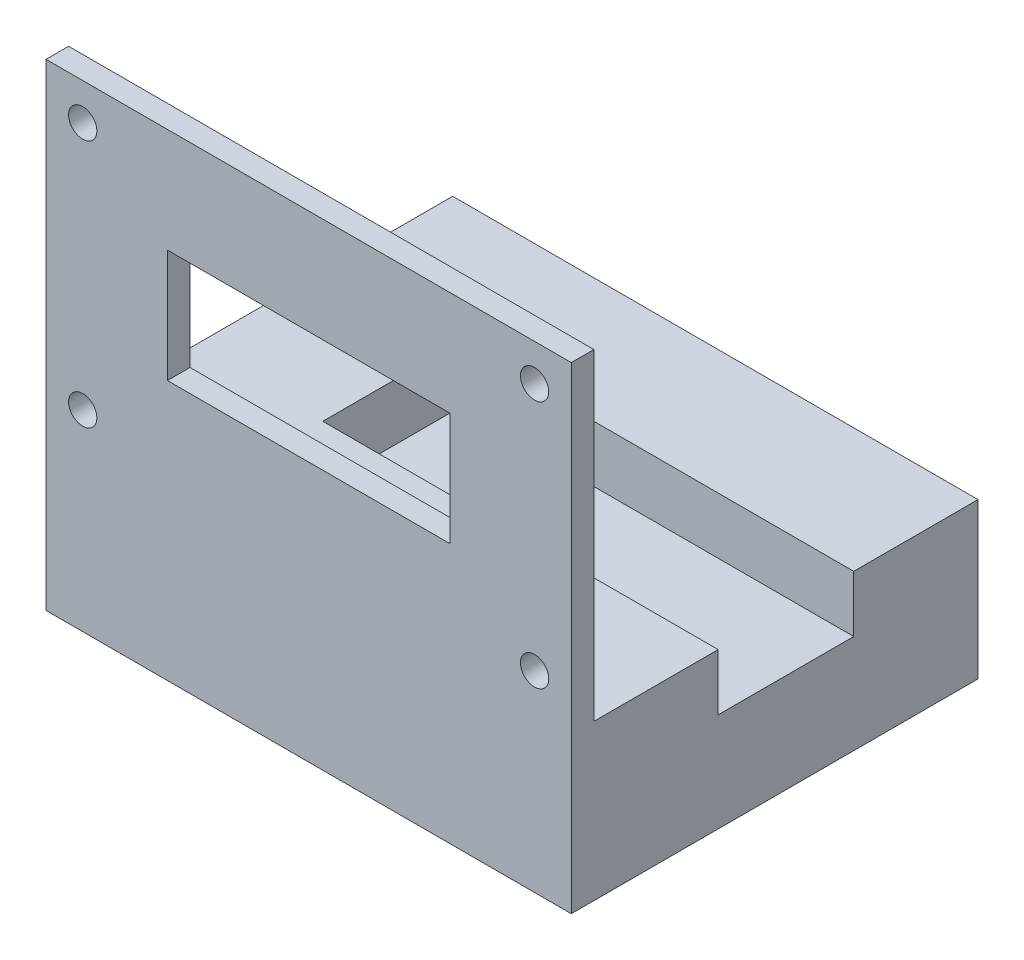
ISO-10303-21;
HEADER;
FILE_DESCRIPTION(('STEP AP214'),'2;1');
FILE_NAME('part.step','',(''),(''),'','','');
FILE_SCHEMA(('AUTOMOTIVE_DESIGN { 1 0 10303 214 1 1 1 1 }'));
ENDSEC;
DATA;
#1=APPLICATION_CONTEXT('core data for automotive mechanical design processes');
#2=APPLICATION_PROTOCOL_DEFINITION('international standard','automotive_design',2000,#1);
#3=PRODUCT_CONTEXT('',#1,'mechanical');
#4=PRODUCT('Part','Part','',(#3));
#5=PRODUCT_RELATED_PRODUCT_CATEGORY('part','',(#4));
#6=PRODUCT_DEFINITION_FORMATION('','',#4);
#7=PRODUCT_DEFINITION_CONTEXT('part definition',#1,'design');
#8=PRODUCT_DEFINITION('design','',#6,#7);
#9=PRODUCT_DEFINITION_SHAPE('','',#8);
#10=(LENGTH_UNIT() NAMED_UNIT(*) SI_UNIT(.MILLI.,.METRE.));
#11=(NAMED_UNIT(*) PLANE_ANGLE_UNIT() SI_UNIT($,.RADIAN.));
#12=(NAMED_UNIT(*) SI_UNIT($,.STERADIAN.) SOLID_ANGLE_UNIT());
#13=UNCERTAINTY_MEASURE_WITH_UNIT(LENGTH_MEASURE(1.E-05),#10,'distance_accuracy_value','');
#14=(GEOMETRIC_REPRESENTATION_CONTEXT(3) GLOBAL_UNCERTAINTY_ASSIGNED_CONTEXT((#13)) GLOBAL_UNIT_ASSIGNED_CONTEXT((#10,
#11,#12)) REPRESENTATION_CONTEXT('',''));
#15=CARTESIAN_POINT('',(0.,0.,0.));
#16=DIRECTION('',(0.,0.,1.));
#17=DIRECTION('',(1.,0.,0.));
#18=AXIS2_PLACEMENT_3D('',#15,#16,#17);
#19=CARTESIAN_POINT('',(23.25,13.75,17.));
#20=DIRECTION('',(-1.,0.,0.));
#21=DIRECTION('',(0.,0.,1.));
#22=AXIS2_PLACEMENT_3D('',#19,#20,#21);
#23=PLANE('',#22);
#24=DIRECTION('',(0.,0.,-1.));
#25=VECTOR('',#24,1.);
#26=CARTESIAN_POINT('',(23.25,8.75,-6.));
#27=LINE('',#26,#25);
#28=CARTESIAN_POINT('',(23.25,8.75,6.));
#29=VERTEX_POINT('',#28);
#30=CARTESIAN_POINT('',(23.25,8.75,-6.));
#31=VERTEX_POINT('',#30);
#32=EDGE_CURVE('E139',#29,#31,#27,.T.);
#33=ORIENTED_EDGE('',*,*,#32,.F.);
#34=DIRECTION('',(0.,1.,0.));
#35=VECTOR('',#34,1.);
#36=CARTESIAN_POINT('',(23.25,8.75,6.));
#37=LINE('',#36,#35);
#38=CARTESIAN_POINT('',(23.25,13.75,6.));
#39=VERTEX_POINT('',#38);
#40=EDGE_CURVE('E183',#29,#39,#37,.T.);
#41=ORIENTED_EDGE('',*,*,#40,.T.);
#42=DIRECTION('',(0.,0.,-1.));
#43=VECTOR('',#42,1.);
#44=CARTESIAN_POINT('',(23.25,13.75,17.));
#45=LINE('',#44,#43);
#46=CARTESIAN_POINT('',(23.25,13.75,17.));
#47=VERTEX_POINT('',#46);
#48=EDGE_CURVE('E238',#47,#39,#45,.T.);
#49=ORIENTED_EDGE('',*,*,#48,.F.);
#50=DIRECTION('',(0.,1.,0.));
#51=VECTOR('',#50,1.);
#52=CARTESIAN_POINT('',(23.25,0.,17.));
#53=LINE('',#52,#51);
#54=CARTESIAN_POINT('',(23.25,42.25,17.));
#55=VERTEX_POINT('',#54);
#56=EDGE_CURVE('E229',#47,#55,#53,.T.);
#57=ORIENTED_EDGE('',*,*,#56,.T.);
#58=DIRECTION('',(0.,0.,-1.));
#59=VECTOR('',#58,1.);
#60=CARTESIAN_POINT('',(23.25,42.25,19.));
#61=LINE('',#60,#59);
#62=CARTESIAN_POINT('',(23.25,42.25,19.));
#63=VERTEX_POINT('',#62);
#64=EDGE_CURVE('E234',#63,#55,#61,.T.);
#65=ORIENTED_EDGE('',*,*,#64,.F.);
#66=DIRECTION('',(0.,1.,0.));
#67=VECTOR('',#66,1.);
#68=CARTESIAN_POINT('',(23.25,0.,19.));
#69=LINE('',#68,#67);
#70=CARTESIAN_POINT('',(23.25,0.,19.));
#71=VERTEX_POINT('',#70);
#72=EDGE_CURVE('E222',#71,#63,#69,.T.);
#73=ORIENTED_EDGE('',*,*,#72,.F.);
#74=DIRECTION('',(0.,0.,-1.));
#75=VECTOR('',#74,1.);
#76=CARTESIAN_POINT('',(23.25,0.,17.));
#77=LINE('',#76,#75);
#78=CARTESIAN_POINT('',(23.25,0.,-17.));
#79=VERTEX_POINT('',#78);
#80=EDGE_CURVE('E237',#71,#79,#77,.T.);
#81=ORIENTED_EDGE('',*,*,#80,.T.);
#82=DIRECTION('',(0.,-1.,0.));
#83=VECTOR('',#82,1.);
#84=CARTESIAN_POINT('',(23.25,13.75,-17.));
#85=LINE('',#84,#83);
#86=CARTESIAN_POINT('',(23.25,13.75,-17.));
#87=VERTEX_POINT('',#86);
#88=EDGE_CURVE('E11',#87,#79,#85,.T.);
#89=ORIENTED_EDGE('',*,*,#88,.F.);
#90=CARTESIAN_POINT('',(23.25,13.75,-6.));
#91=VERTEX_POINT('',#90);
#92=EDGE_CURVE('E152',#91,#87,#45,.T.);
#93=ORIENTED_EDGE('',*,*,#92,.F.);
#94=DIRECTION('',(0.,1.,0.));
#95=VECTOR('',#94,1.);
#96=CARTESIAN_POINT('',(23.25,8.75,-6.));
#97=LINE('',#96,#95);
#98=EDGE_CURVE('E46',#31,#91,#97,.T.);
#99=ORIENTED_EDGE('',*,*,#98,.F.);
#100=EDGE_LOOP('',(#33,#41,#49,#57,#65,#73,#81,#89,#93,#99));
#101=FACE_BOUND('',#100,.T.);
#102=ADVANCED_FACE('F32',(#101),#23,.F.);
#103=CARTESIAN_POINT('',(-23.25,13.75,-17.));
#104=DIRECTION('',(0.,0.,1.));
#105=DIRECTION('',(1.,0.,0.));
#106=AXIS2_PLACEMENT_3D('',#103,#104,#105);
#107=PLANE('',#106);
#108=DIRECTION('',(-1.,0.,0.));
#109=VECTOR('',#108,1.);
#110=CARTESIAN_POINT('',(-23.25,0.,-17.));
#111=LINE('',#110,#109);
#112=CARTESIAN_POINT('',(-23.25,0.,-17.));
#113=VERTEX_POINT('',#112);
#114=EDGE_CURVE('E251',#79,#113,#111,.T.);
#115=ORIENTED_EDGE('',*,*,#114,.T.);
#116=DIRECTION('',(0.,-1.,0.));
#117=VECTOR('',#116,1.);
#118=CARTESIAN_POINT('',(-23.25,13.75,-17.));
#119=LINE('',#118,#117);
#120=CARTESIAN_POINT('',(-23.25,13.75,-17.));
#121=VERTEX_POINT('',#120);
#122=EDGE_CURVE('E39',#121,#113,#119,.T.);
#123=ORIENTED_EDGE('',*,*,#122,.F.);
#124=DIRECTION('',(-1.,0.,0.));
#125=VECTOR('',#124,1.);
#126=CARTESIAN_POINT('',(-23.25,13.75,-17.));
#127=LINE('',#126,#125);
#128=EDGE_CURVE('E241',#87,#121,#127,.T.);
#129=ORIENTED_EDGE('',*,*,#128,.F.);
#130=ORIENTED_EDGE('',*,*,#88,.T.);
#131=EDGE_LOOP('',(#115,#123,#129,#130));
#132=FACE_BOUND('',#131,.T.);
#133=ADVANCED_FACE('F338',(#132),#107,.F.);
#134=CARTESIAN_POINT('',(-23.25,13.75,17.));
#135=DIRECTION('',(1.,0.,0.));
#136=DIRECTION('',(0.,0.,-1.));
#137=AXIS2_PLACEMENT_3D('',#134,#135,#136);
#138=PLANE('',#137);
#139=DIRECTION('',(0.,0.,1.));
#140=VECTOR('',#139,1.);
#141=CARTESIAN_POINT('',(-23.25,0.,17.));
#142=LINE('',#141,#140);
#143=CARTESIAN_POINT('',(-23.25,0.,19.));
#144=VERTEX_POINT('',#143);
#145=EDGE_CURVE('E253',#113,#144,#142,.T.);
#146=ORIENTED_EDGE('',*,*,#145,.T.);
#147=DIRECTION('',(0.,-1.,0.));
#148=VECTOR('',#147,1.);
#149=CARTESIAN_POINT('',(-23.25,0.,19.));
#150=LINE('',#149,#148);
#151=CARTESIAN_POINT('',(-23.25,42.25,19.));
#152=VERTEX_POINT('',#151);
#153=EDGE_CURVE('E215',#152,#144,#150,.T.);
#154=ORIENTED_EDGE('',*,*,#153,.F.);
#155=DIRECTION('',(0.,0.,-1.));
#156=VECTOR('',#155,1.);
#157=CARTESIAN_POINT('',(-23.25,42.25,19.));
#158=LINE('',#157,#156);
#159=CARTESIAN_POINT('',(-23.25,42.25,17.));
#160=VERTEX_POINT('',#159);
#161=EDGE_CURVE('E226',#152,#160,#158,.T.);
#162=ORIENTED_EDGE('',*,*,#161,.T.);
#163=DIRECTION('',(0.,-1.,0.));
#164=VECTOR('',#163,1.);
#165=CARTESIAN_POINT('',(-23.25,0.,17.));
#166=LINE('',#165,#164);
#167=CARTESIAN_POINT('',(-23.25,13.75,17.));
#168=VERTEX_POINT('',#167);
#169=EDGE_CURVE('E212',#160,#168,#166,.T.);
#170=ORIENTED_EDGE('',*,*,#169,.T.);
#171=DIRECTION('',(0.,0.,1.));
#172=VECTOR('',#171,1.);
#173=CARTESIAN_POINT('',(-23.25,13.75,17.));
#174=LINE('',#173,#172);
#175=EDGE_CURVE('E243',#121,#168,#174,.T.);
#176=ORIENTED_EDGE('',*,*,#175,.F.);
#177=ORIENTED_EDGE('',*,*,#122,.T.);
#178=EDGE_LOOP('',(#146,#154,#162,#170,#176,#177));
#179=FACE_BOUND('',#178,.T.);
#180=ADVANCED_FACE('F259',(#179),#138,.F.);
#181=CARTESIAN_POINT('',(0.,13.75,0.));
#182=DIRECTION('',(0.,-1.,0.));
#183=DIRECTION('',(0.,0.,-1.));
#184=AXIS2_PLACEMENT_3D('',#181,#182,#183);
#185=PLANE('',#184);
#186=ORIENTED_EDGE('',*,*,#48,.T.);
#187=DIRECTION('',(1.,0.,0.));
#188=VECTOR('',#187,1.);
#189=CARTESIAN_POINT('',(23.25,13.75,6.));
#190=LINE('',#189,#188);
#191=CARTESIAN_POINT('',(-11.75,13.75,6.00000000000001));
#192=VERTEX_POINT('',#191);
#193=EDGE_CURVE('E148',#192,#39,#190,.T.);
#194=ORIENTED_EDGE('',*,*,#193,.F.);
#195=DIRECTION('',(0.,0.,1.));
#196=VECTOR('',#195,1.);
#197=CARTESIAN_POINT('',(-11.75,13.75,-5.99999999999999));
#198=LINE('',#197,#196);
#199=CARTESIAN_POINT('',(-11.75,13.75,-5.99999999999999));
#200=VERTEX_POINT('',#199);
#201=EDGE_CURVE('E285',#200,#192,#198,.T.);
#202=ORIENTED_EDGE('',*,*,#201,.F.);
#203=DIRECTION('',(-1.,0.,0.));
#204=VECTOR('',#203,1.);
#205=CARTESIAN_POINT('',(23.25,13.75,-6.));
#206=LINE('',#205,#204);
#207=EDGE_CURVE('E288',#91,#200,#206,.T.);
#208=ORIENTED_EDGE('',*,*,#207,.F.);
#209=ORIENTED_EDGE('',*,*,#92,.T.);
#210=ORIENTED_EDGE('',*,*,#128,.T.);
#211=ORIENTED_EDGE('',*,*,#175,.T.);
#212=DIRECTION('',(1.,0.,0.));
#213=VECTOR('',#212,1.);
#214=CARTESIAN_POINT('',(-23.25,13.75,17.));
#215=LINE('',#214,#213);
#216=EDGE_CURVE('E246',#168,#47,#215,.T.);
#217=ORIENTED_EDGE('',*,*,#216,.T.);
#218=EDGE_LOOP('',(#186,#194,#202,#208,#209,#210,#211,#217));
#219=FACE_BOUND('',#218,.T.);
#220=ADVANCED_FACE('F278',(#219),#185,.F.);
#221=CARTESIAN_POINT('',(0.,0.,0.));
#222=DIRECTION('',(0.,-1.,0.));
#223=DIRECTION('',(0.,0.,-1.));
#224=AXIS2_PLACEMENT_3D('',#221,#222,#223);
#225=PLANE('',#224);
#226=CARTESIAN_POINT('',(16.25,0.,12.));
#227=DIRECTION('',(0.,-1.,0.));
#228=DIRECTION('',(0.,0.,-1.));
#229=AXIS2_PLACEMENT_3D('',#226,#227,#228);
#230=CIRCLE('',#229,2.);
#231=CARTESIAN_POINT('',(16.25,0.,10.));
#232=VERTEX_POINT('',#231);
#233=EDGE_CURVE('E295',#232,#232,#230,.T.);
#234=ORIENTED_EDGE('',*,*,#233,.F.);
#235=EDGE_LOOP('',(#234));
#236=FACE_BOUND('',#235,.T.);
#237=CARTESIAN_POINT('',(-16.25,0.,-10.));
#238=DIRECTION('',(0.,-1.,0.));
#239=DIRECTION('',(0.,0.,-1.));
#240=AXIS2_PLACEMENT_3D('',#237,#238,#239);
#241=CIRCLE('',#240,2.);
#242=CARTESIAN_POINT('',(-16.25,0.,-12.));
#243=VERTEX_POINT('',#242);
#244=EDGE_CURVE('E301',#243,#243,#241,.T.);
#245=ORIENTED_EDGE('',*,*,#244,.F.);
#246=EDGE_LOOP('',(#245));
#247=FACE_BOUND('',#246,.T.);
#248=CARTESIAN_POINT('',(-16.25,0.,12.));
#249=DIRECTION('',(0.,-1.,0.));
#250=DIRECTION('',(0.,0.,-1.));
#251=AXIS2_PLACEMENT_3D('',#248,#249,#250);
#252=CIRCLE('',#251,2.);
#253=CARTESIAN_POINT('',(-16.25,0.,10.));
#254=VERTEX_POINT('',#253);
#255=EDGE_CURVE('E302',#254,#254,#252,.T.);
#256=ORIENTED_EDGE('',*,*,#255,.F.);
#257=EDGE_LOOP('',(#256));
#258=FACE_BOUND('',#257,.T.);
#259=CARTESIAN_POINT('',(16.25,0.,-10.));
#260=DIRECTION('',(0.,-1.,0.));
#261=DIRECTION('',(0.,0.,-1.));
#262=AXIS2_PLACEMENT_3D('',#259,#260,#261);
#263=CIRCLE('',#262,2.);
#264=CARTESIAN_POINT('',(16.25,0.,-12.));
#265=VERTEX_POINT('',#264);
#266=EDGE_CURVE('E292',#265,#265,#263,.T.);
#267=ORIENTED_EDGE('',*,*,#266,.F.);
#268=EDGE_LOOP('',(#267));
#269=FACE_BOUND('',#268,.T.);
#270=ORIENTED_EDGE('',*,*,#80,.F.);
#271=DIRECTION('',(1.,0.,0.));
#272=VECTOR('',#271,1.);
#273=CARTESIAN_POINT('',(-23.25,0.,19.));
#274=LINE('',#273,#272);
#275=EDGE_CURVE('E218',#144,#71,#274,.T.);
#276=ORIENTED_EDGE('',*,*,#275,.F.);
#277=ORIENTED_EDGE('',*,*,#145,.F.);
#278=ORIENTED_EDGE('',*,*,#114,.F.);
#279=EDGE_LOOP('',(#270,#276,#277,#278));
#280=FACE_BOUND('',#279,.T.);
#281=ADVANCED_FACE('F265',(#236,#247,#258,#269,#280),#225,.T.);
#282=CARTESIAN_POINT('',(0.,0.,17.));
#283=DIRECTION('',(0.,0.,-1.));
#284=DIRECTION('',(-1.,0.,0.));
#285=AXIS2_PLACEMENT_3D('',#282,#283,#284);
#286=PLANE('',#285);
#287=DIRECTION('',(0.,-1.,0.));
#288=VECTOR('',#287,1.);
#289=CARTESIAN_POINT('',(-12.5,33.,17.));
#290=LINE('',#289,#288);
#291=CARTESIAN_POINT('',(-12.5,33.,17.));
#292=VERTEX_POINT('',#291);
#293=CARTESIAN_POINT('',(-12.5,23.,17.));
#294=VERTEX_POINT('',#293);
#295=EDGE_CURVE('E186',#292,#294,#290,.T.);
#296=ORIENTED_EDGE('',*,*,#295,.T.);
#297=DIRECTION('',(1.,0.,0.));
#298=VECTOR('',#297,1.);
#299=CARTESIAN_POINT('',(-12.5,23.,17.));
#300=LINE('',#299,#298);
#301=CARTESIAN_POINT('',(12.5,23.,17.));
#302=VERTEX_POINT('',#301);
#303=EDGE_CURVE('E178',#294,#302,#300,.T.);
#304=ORIENTED_EDGE('',*,*,#303,.T.);
#305=DIRECTION('',(0.,1.,0.));
#306=VECTOR('',#305,1.);
#307=CARTESIAN_POINT('',(12.5,33.,17.));
#308=LINE('',#307,#306);
#309=CARTESIAN_POINT('',(12.5,33.,17.));
#310=VERTEX_POINT('',#309);
#311=EDGE_CURVE('E179',#302,#310,#308,.T.);
#312=ORIENTED_EDGE('',*,*,#311,.T.);
#313=DIRECTION('',(-1.,0.,0.));
#314=VECTOR('',#313,1.);
#315=CARTESIAN_POINT('',(-12.5,33.,17.));
#316=LINE('',#315,#314);
#317=EDGE_CURVE('E182',#310,#292,#316,.T.);
#318=ORIENTED_EDGE('',*,*,#317,.T.);
#319=EDGE_LOOP('',(#296,#304,#312,#318));
#320=FACE_BOUND('',#319,.T.);
#321=CARTESIAN_POINT('',(-20.,17.,17.));
#322=DIRECTION('',(0.,0.,-1.));
#323=DIRECTION('',(-1.,0.,0.));
#324=AXIS2_PLACEMENT_3D('',#321,#322,#323);
#325=CIRCLE('',#324,1.25);
#326=CARTESIAN_POINT('',(-21.25,17.,17.));
#327=VERTEX_POINT('',#326);
#328=EDGE_CURVE('E175',#327,#327,#325,.F.);
#329=ORIENTED_EDGE('',*,*,#328,.T.);
#330=EDGE_LOOP('',(#329));
#331=FACE_BOUND('',#330,.T.);
#332=CARTESIAN_POINT('',(20.,39.,17.));
#333=DIRECTION('',(0.,0.,-1.));
#334=DIRECTION('',(-1.,0.,0.));
#335=AXIS2_PLACEMENT_3D('',#332,#333,#334);
#336=CIRCLE('',#335,1.25);
#337=CARTESIAN_POINT('',(18.75,39.,17.));
#338=VERTEX_POINT('',#337);
#339=EDGE_CURVE('E169',#338,#338,#336,.F.);
#340=ORIENTED_EDGE('',*,*,#339,.T.);
#341=EDGE_LOOP('',(#340));
#342=FACE_BOUND('',#341,.T.);
#343=CARTESIAN_POINT('',(20.,17.,17.));
#344=DIRECTION('',(0.,0.,-1.));
#345=DIRECTION('',(-1.,0.,0.));
#346=AXIS2_PLACEMENT_3D('',#343,#344,#345);
#347=CIRCLE('',#346,1.25);
#348=CARTESIAN_POINT('',(18.75,17.,17.));
#349=VERTEX_POINT('',#348);
#350=EDGE_CURVE('E163',#349,#349,#347,.F.);
#351=ORIENTED_EDGE('',*,*,#350,.T.);
#352=EDGE_LOOP('',(#351));
#353=FACE_BOUND('',#352,.T.);
#354=CARTESIAN_POINT('',(-20.,39.,17.));
#355=DIRECTION('',(0.,0.,-1.));
#356=DIRECTION('',(-1.,0.,0.));
#357=AXIS2_PLACEMENT_3D('',#354,#355,#356);
#358=CIRCLE('',#357,1.25);
#359=CARTESIAN_POINT('',(-21.25,39.,17.));
#360=VERTEX_POINT('',#359);
#361=EDGE_CURVE('E162',#360,#360,#358,.F.);
#362=ORIENTED_EDGE('',*,*,#361,.T.);
#363=EDGE_LOOP('',(#362));
#364=FACE_BOUND('',#363,.T.);
#365=ORIENTED_EDGE('',*,*,#216,.F.);
#366=ORIENTED_EDGE('',*,*,#169,.F.);
#367=DIRECTION('',(-1.,0.,0.));
#368=VECTOR('',#367,1.);
#369=CARTESIAN_POINT('',(-23.25,42.25,17.));
#370=LINE('',#369,#368);
#371=EDGE_CURVE('E219',#55,#160,#370,.T.);
#372=ORIENTED_EDGE('',*,*,#371,.F.);
#373=ORIENTED_EDGE('',*,*,#56,.F.);
#374=EDGE_LOOP('',(#365,#366,#372,#373));
#375=FACE_BOUND('',#374,.T.);
#376=ADVANCED_FACE('F275',(#320,#331,#342,#353,#364,#375),#286,.T.);
#377=CARTESIAN_POINT('',(-23.25,42.25,19.));
#378=DIRECTION('',(0.,-1.,0.));
#379=DIRECTION('',(0.,0.,-1.));
#380=AXIS2_PLACEMENT_3D('',#377,#378,#379);
#381=PLANE('',#380);
#382=ORIENTED_EDGE('',*,*,#371,.T.);
#383=ORIENTED_EDGE('',*,*,#161,.F.);
#384=DIRECTION('',(-1.,0.,0.));
#385=VECTOR('',#384,1.);
#386=CARTESIAN_POINT('',(-23.25,42.25,19.));
#387=LINE('',#386,#385);
#388=EDGE_CURVE('E224',#63,#152,#387,.T.);
#389=ORIENTED_EDGE('',*,*,#388,.F.);
#390=ORIENTED_EDGE('',*,*,#64,.T.);
#391=EDGE_LOOP('',(#382,#383,#389,#390));
#392=FACE_BOUND('',#391,.T.);
#393=ADVANCED_FACE('F349',(#392),#381,.F.);
#394=CARTESIAN_POINT('',(0.,0.,19.));
#395=DIRECTION('',(0.,0.,-1.));
#396=DIRECTION('',(-1.,0.,0.));
#397=AXIS2_PLACEMENT_3D('',#394,#395,#396);
#398=PLANE('',#397);
#399=DIRECTION('',(1.,0.,0.));
#400=VECTOR('',#399,1.);
#401=CARTESIAN_POINT('',(-12.5,23.,19.));
#402=LINE('',#401,#400);
#403=CARTESIAN_POINT('',(-12.5,23.,19.));
#404=VERTEX_POINT('',#403);
#405=CARTESIAN_POINT('',(12.5,23.,19.));
#406=VERTEX_POINT('',#405);
#407=EDGE_CURVE('E191',#404,#406,#402,.T.);
#408=ORIENTED_EDGE('',*,*,#407,.F.);
#409=DIRECTION('',(0.,-1.,0.));
#410=VECTOR('',#409,1.);
#411=CARTESIAN_POINT('',(-12.5,33.,19.));
#412=LINE('',#411,#410);
#413=CARTESIAN_POINT('',(-12.5,33.,19.));
#414=VERTEX_POINT('',#413);
#415=EDGE_CURVE('E189',#414,#404,#412,.T.);
#416=ORIENTED_EDGE('',*,*,#415,.F.);
#417=DIRECTION('',(-1.,0.,0.));
#418=VECTOR('',#417,1.);
#419=CARTESIAN_POINT('',(-12.5,33.,19.));
#420=LINE('',#419,#418);
#421=CARTESIAN_POINT('',(12.5,33.,19.));
#422=VERTEX_POINT('',#421);
#423=EDGE_CURVE('E196',#422,#414,#420,.T.);
#424=ORIENTED_EDGE('',*,*,#423,.F.);
#425=DIRECTION('',(0.,1.,0.));
#426=VECTOR('',#425,1.);
#427=CARTESIAN_POINT('',(12.5,33.,19.));
#428=LINE('',#427,#426);
#429=EDGE_CURVE('E193',#406,#422,#428,.T.);
#430=ORIENTED_EDGE('',*,*,#429,.F.);
#431=EDGE_LOOP('',(#408,#416,#424,#430));
#432=FACE_BOUND('',#431,.T.);
#433=CARTESIAN_POINT('',(-20.,17.,19.));
#434=DIRECTION('',(0.,0.,1.));
#435=DIRECTION('',(-1.,0.,0.));
#436=AXIS2_PLACEMENT_3D('',#433,#434,#435);
#437=CIRCLE('',#436,1.25);
#438=CARTESIAN_POINT('',(-21.25,17.,19.));
#439=VERTEX_POINT('',#438);
#440=EDGE_CURVE('E172',#439,#439,#437,.T.);
#441=ORIENTED_EDGE('',*,*,#440,.F.);
#442=EDGE_LOOP('',(#441));
#443=FACE_BOUND('',#442,.T.);
#444=CARTESIAN_POINT('',(20.,39.,19.));
#445=DIRECTION('',(0.,0.,1.));
#446=DIRECTION('',(-1.,0.,0.));
#447=AXIS2_PLACEMENT_3D('',#444,#445,#446);
#448=CIRCLE('',#447,1.25);
#449=CARTESIAN_POINT('',(18.75,39.,19.));
#450=VERTEX_POINT('',#449);
#451=EDGE_CURVE('E166',#450,#450,#448,.T.);
#452=ORIENTED_EDGE('',*,*,#451,.F.);
#453=EDGE_LOOP('',(#452));
#454=FACE_BOUND('',#453,.T.);
#455=CARTESIAN_POINT('',(20.,17.,19.));
#456=DIRECTION('',(0.,0.,1.));
#457=DIRECTION('',(1.,0.,0.));
#458=AXIS2_PLACEMENT_3D('',#455,#456,#457);
#459=CIRCLE('',#458,1.25);
#460=CARTESIAN_POINT('',(21.25,17.,19.));
#461=VERTEX_POINT('',#460);
#462=EDGE_CURVE('E159',#461,#461,#459,.T.);
#463=ORIENTED_EDGE('',*,*,#462,.F.);
#464=EDGE_LOOP('',(#463));
#465=FACE_BOUND('',#464,.T.);
#466=CARTESIAN_POINT('',(-20.,39.,19.));
#467=DIRECTION('',(0.,0.,1.));
#468=DIRECTION('',(1.,0.,0.));
#469=AXIS2_PLACEMENT_3D('',#466,#467,#468);
#470=CIRCLE('',#469,1.25);
#471=CARTESIAN_POINT('',(-18.75,39.,19.));
#472=VERTEX_POINT('',#471);
#473=EDGE_CURVE('E209',#472,#472,#470,.T.);
#474=ORIENTED_EDGE('',*,*,#473,.F.);
#475=EDGE_LOOP('',(#474));
#476=FACE_BOUND('',#475,.T.);
#477=ORIENTED_EDGE('',*,*,#153,.T.);
#478=ORIENTED_EDGE('',*,*,#275,.T.);
#479=ORIENTED_EDGE('',*,*,#72,.T.);
#480=ORIENTED_EDGE('',*,*,#388,.T.);
#481=EDGE_LOOP('',(#477,#478,#479,#480));
#482=FACE_BOUND('',#481,.T.);
#483=ADVANCED_FACE('F268',(#432,#443,#454,#465,#476,#482),#398,.F.);
#484=CARTESIAN_POINT('',(-20.,39.,-17.001));
#485=DIRECTION('',(0.,0.,1.));
#486=DIRECTION('',(1.,0.,0.));
#487=AXIS2_PLACEMENT_3D('',#484,#485,#486);
#488=CYLINDRICAL_SURFACE('',#487,1.25);
#489=ORIENTED_EDGE('',*,*,#361,.F.);
#490=EDGE_LOOP('',(#489));
#491=FACE_BOUND('',#490,.T.);
#492=ORIENTED_EDGE('',*,*,#473,.T.);
#493=EDGE_LOOP('',(#492));
#494=FACE_BOUND('',#493,.T.);
#495=ADVANCED_FACE('F357',(#491,#494),#488,.F.);
#496=CARTESIAN_POINT('',(20.,17.,-17.001));
#497=DIRECTION('',(0.,0.,1.));
#498=DIRECTION('',(1.,0.,0.));
#499=AXIS2_PLACEMENT_3D('',#496,#497,#498);
#500=CYLINDRICAL_SURFACE('',#499,1.25);
#501=ORIENTED_EDGE('',*,*,#350,.F.);
#502=EDGE_LOOP('',(#501));
#503=FACE_BOUND('',#502,.T.);
#504=ORIENTED_EDGE('',*,*,#462,.T.);
#505=EDGE_LOOP('',(#504));
#506=FACE_BOUND('',#505,.T.);
#507=ADVANCED_FACE('F361',(#503,#506),#500,.F.);
#508=CARTESIAN_POINT('',(20.,39.,-17.001));
#509=DIRECTION('',(0.,0.,1.));
#510=DIRECTION('',(1.,0.,0.));
#511=AXIS2_PLACEMENT_3D('',#508,#509,#510);
#512=CYLINDRICAL_SURFACE('',#511,1.25);
#513=ORIENTED_EDGE('',*,*,#339,.F.);
#514=EDGE_LOOP('',(#513));
#515=FACE_BOUND('',#514,.T.);
#516=ORIENTED_EDGE('',*,*,#451,.T.);
#517=EDGE_LOOP('',(#516));
#518=FACE_BOUND('',#517,.T.);
#519=ADVANCED_FACE('F382',(#515,#518),#512,.F.);
#520=CARTESIAN_POINT('',(-20.,17.,-17.001));
#521=DIRECTION('',(0.,0.,1.));
#522=DIRECTION('',(1.,0.,0.));
#523=AXIS2_PLACEMENT_3D('',#520,#521,#522);
#524=CYLINDRICAL_SURFACE('',#523,1.25);
#525=ORIENTED_EDGE('',*,*,#328,.F.);
#526=EDGE_LOOP('',(#525));
#527=FACE_BOUND('',#526,.T.);
#528=ORIENTED_EDGE('',*,*,#440,.T.);
#529=EDGE_LOOP('',(#528));
#530=FACE_BOUND('',#529,.T.);
#531=ADVANCED_FACE('F367',(#527,#530),#524,.F.);
#532=CARTESIAN_POINT('',(-12.5,33.,-17.001));
#533=DIRECTION('',(-1.,0.,0.));
#534=DIRECTION('',(0.,-1.,0.));
#535=AXIS2_PLACEMENT_3D('',#532,#533,#534);
#536=PLANE('',#535);
#537=DIRECTION('',(0.,0.,1.));
#538=VECTOR('',#537,1.);
#539=CARTESIAN_POINT('',(-12.5,33.,-17.001));
#540=LINE('',#539,#538);
#541=EDGE_CURVE('E200',#292,#414,#540,.T.);
#542=ORIENTED_EDGE('',*,*,#541,.T.);
#543=ORIENTED_EDGE('',*,*,#415,.T.);
#544=DIRECTION('',(0.,0.,1.));
#545=VECTOR('',#544,1.);
#546=CARTESIAN_POINT('',(-12.5,23.,-17.001));
#547=LINE('',#546,#545);
#548=EDGE_CURVE('E199',#294,#404,#547,.T.);
#549=ORIENTED_EDGE('',*,*,#548,.F.);
#550=ORIENTED_EDGE('',*,*,#295,.F.);
#551=EDGE_LOOP('',(#542,#543,#549,#550));
#552=FACE_BOUND('',#551,.T.);
#553=ADVANCED_FACE('F363',(#552),#536,.F.);
#554=CARTESIAN_POINT('',(-12.5,33.,-17.001));
#555=DIRECTION('',(0.,1.,0.));
#556=DIRECTION('',(0.,0.,1.));
#557=AXIS2_PLACEMENT_3D('',#554,#555,#556);
#558=PLANE('',#557);
#559=DIRECTION('',(0.,0.,1.));
#560=VECTOR('',#559,1.);
#561=CARTESIAN_POINT('',(12.5,33.,-17.001));
#562=LINE('',#561,#560);
#563=EDGE_CURVE('E202',#310,#422,#562,.T.);
#564=ORIENTED_EDGE('',*,*,#563,.T.);
#565=ORIENTED_EDGE('',*,*,#423,.T.);
#566=ORIENTED_EDGE('',*,*,#541,.F.);
#567=ORIENTED_EDGE('',*,*,#317,.F.);
#568=EDGE_LOOP('',(#564,#565,#566,#567));
#569=FACE_BOUND('',#568,.T.);
#570=ADVANCED_FACE('F366',(#569),#558,.F.);
#571=CARTESIAN_POINT('',(12.5,33.,-17.001));
#572=DIRECTION('',(1.,0.,0.));
#573=DIRECTION('',(0.,1.,0.));
#574=AXIS2_PLACEMENT_3D('',#571,#572,#573);
#575=PLANE('',#574);
#576=DIRECTION('',(0.,0.,1.));
#577=VECTOR('',#576,1.);
#578=CARTESIAN_POINT('',(12.5,23.,-17.001));
#579=LINE('',#578,#577);
#580=EDGE_CURVE('E54',#302,#406,#579,.T.);
#581=ORIENTED_EDGE('',*,*,#580,.T.);
#582=ORIENTED_EDGE('',*,*,#429,.T.);
#583=ORIENTED_EDGE('',*,*,#563,.F.);
#584=ORIENTED_EDGE('',*,*,#311,.F.);
#585=EDGE_LOOP('',(#581,#582,#583,#584));
#586=FACE_BOUND('',#585,.T.);
#587=ADVANCED_FACE('F373',(#586),#575,.F.);
#588=CARTESIAN_POINT('',(-12.5,23.,-17.001));
#589=DIRECTION('',(0.,-1.,0.));
#590=DIRECTION('',(0.,0.,-1.));
#591=AXIS2_PLACEMENT_3D('',#588,#589,#590);
#592=PLANE('',#591);
#593=ORIENTED_EDGE('',*,*,#548,.T.);
#594=ORIENTED_EDGE('',*,*,#407,.T.);
#595=ORIENTED_EDGE('',*,*,#580,.F.);
#596=ORIENTED_EDGE('',*,*,#303,.F.);
#597=EDGE_LOOP('',(#593,#594,#595,#596));
#598=FACE_BOUND('',#597,.T.);
#599=ADVANCED_FACE('F369',(#598),#592,.F.);
#600=CARTESIAN_POINT('',(23.25,8.75,6.));
#601=DIRECTION('',(0.,0.,1.));
#602=DIRECTION('',(1.,0.,0.));
#603=AXIS2_PLACEMENT_3D('',#600,#601,#602);
#604=PLANE('',#603);
#605=ORIENTED_EDGE('',*,*,#193,.T.);
#606=ORIENTED_EDGE('',*,*,#40,.F.);
#607=DIRECTION('',(1.,0.,0.));
#608=VECTOR('',#607,1.);
#609=CARTESIAN_POINT('',(23.25,8.75,6.));
#610=LINE('',#609,#608);
#611=CARTESIAN_POINT('',(-11.75,8.75,6.00000000000001));
#612=VERTEX_POINT('',#611);
#613=EDGE_CURVE('E145',#612,#29,#610,.T.);
#614=ORIENTED_EDGE('',*,*,#613,.F.);
#615=DIRECTION('',(0.,1.,0.));
#616=VECTOR('',#615,1.);
#617=CARTESIAN_POINT('',(-11.75,8.75,6.00000000000001));
#618=LINE('',#617,#616);
#619=EDGE_CURVE('E154',#612,#192,#618,.T.);
#620=ORIENTED_EDGE('',*,*,#619,.T.);
#621=EDGE_LOOP('',(#605,#606,#614,#620));
#622=FACE_BOUND('',#621,.T.);
#623=ADVANCED_FACE('F372',(#622),#604,.F.);
#624=CARTESIAN_POINT('',(-11.75,8.75,-5.99999999999999));
#625=DIRECTION('',(-1.,0.,0.));
#626=DIRECTION('',(0.,0.,1.));
#627=AXIS2_PLACEMENT_3D('',#624,#625,#626);
#628=PLANE('',#627);
#629=ORIENTED_EDGE('',*,*,#201,.T.);
#630=ORIENTED_EDGE('',*,*,#619,.F.);
#631=DIRECTION('',(0.,0.,1.));
#632=VECTOR('',#631,1.);
#633=CARTESIAN_POINT('',(-11.75,8.75,-5.99999999999999));
#634=LINE('',#633,#632);
#635=CARTESIAN_POINT('',(-11.75,8.75,-5.99999999999999));
#636=VERTEX_POINT('',#635);
#637=EDGE_CURVE('E138',#636,#612,#634,.T.);
#638=ORIENTED_EDGE('',*,*,#637,.F.);
#639=DIRECTION('',(0.,1.,0.));
#640=VECTOR('',#639,1.);
#641=CARTESIAN_POINT('',(-11.75,8.75,-5.99999999999999));
#642=LINE('',#641,#640);
#643=EDGE_CURVE('E134',#636,#200,#642,.T.);
#644=ORIENTED_EDGE('',*,*,#643,.T.);
#645=EDGE_LOOP('',(#629,#630,#638,#644));
#646=FACE_BOUND('',#645,.T.);
#647=ADVANCED_FACE('F392',(#646),#628,.F.);
#648=CARTESIAN_POINT('',(23.25,8.75,-6.));
#649=DIRECTION('',(0.,0.,-1.));
#650=DIRECTION('',(-1.,0.,0.));
#651=AXIS2_PLACEMENT_3D('',#648,#649,#650);
#652=PLANE('',#651);
#653=ORIENTED_EDGE('',*,*,#207,.T.);
#654=ORIENTED_EDGE('',*,*,#643,.F.);
#655=DIRECTION('',(-1.,0.,0.));
#656=VECTOR('',#655,1.);
#657=CARTESIAN_POINT('',(23.25,8.75,-6.));
#658=LINE('',#657,#656);
#659=EDGE_CURVE('E131',#31,#636,#658,.T.);
#660=ORIENTED_EDGE('',*,*,#659,.F.);
#661=ORIENTED_EDGE('',*,*,#98,.T.);
#662=EDGE_LOOP('',(#653,#654,#660,#661));
#663=FACE_BOUND('',#662,.T.);
#664=ADVANCED_FACE('F133',(#663),#652,.F.);
#665=CARTESIAN_POINT('',(0.,8.75,0.));
#666=DIRECTION('',(0.,-1.,0.));
#667=DIRECTION('',(0.,0.,-1.));
#668=AXIS2_PLACEMENT_3D('',#665,#666,#667);
#669=PLANE('',#668);
#670=ORIENTED_EDGE('',*,*,#32,.T.);
#671=ORIENTED_EDGE('',*,*,#659,.T.);
#672=ORIENTED_EDGE('',*,*,#637,.T.);
#673=ORIENTED_EDGE('',*,*,#613,.T.);
#674=EDGE_LOOP('',(#670,#671,#672,#673));
#675=FACE_BOUND('',#674,.T.);
#676=ADVANCED_FACE('F143',(#675),#669,.F.);
#677=CARTESIAN_POINT('',(16.25,10.,-10.));
#678=DIRECTION('',(0.,-1.,0.));
#679=DIRECTION('',(0.,0.,-1.));
#680=AXIS2_PLACEMENT_3D('',#677,#678,#679);
#681=CYLINDRICAL_SURFACE('',#680,2.);
#682=CARTESIAN_POINT('',(16.25,10.,-10.));
#683=DIRECTION('',(0.,-1.,0.));
#684=DIRECTION('',(0.,0.,-1.));
#685=AXIS2_PLACEMENT_3D('',#682,#683,#684);
#686=CIRCLE('',#685,2.);
#687=CARTESIAN_POINT('',(16.25,10.,-12.));
#688=VERTEX_POINT('',#687);
#689=EDGE_CURVE('E289',#688,#688,#686,.T.);
#690=ORIENTED_EDGE('',*,*,#689,.F.);
#691=EDGE_LOOP('',(#690));
#692=FACE_BOUND('',#691,.T.);
#693=ORIENTED_EDGE('',*,*,#266,.T.);
#694=EDGE_LOOP('',(#693));
#695=FACE_BOUND('',#694,.T.);
#696=ADVANCED_FACE('F324',(#692,#695),#681,.F.);
#697=CARTESIAN_POINT('',(16.25,10.,-10.));
#698=DIRECTION('',(0.,-1.,0.));
#699=DIRECTION('',(0.,0.,-1.));
#700=AXIS2_PLACEMENT_3D('',#697,#698,#699);
#701=PLANE('',#700);
#702=ORIENTED_EDGE('',*,*,#689,.T.);
#703=EDGE_LOOP('',(#702));
#704=FACE_BOUND('',#703,.T.);
#705=ADVANCED_FACE('F326',(#704),#701,.T.);
#706=CARTESIAN_POINT('',(-16.25,10.,12.));
#707=DIRECTION('',(0.,-1.,0.));
#708=DIRECTION('',(0.,0.,-1.));
#709=AXIS2_PLACEMENT_3D('',#706,#707,#708);
#710=CYLINDRICAL_SURFACE('',#709,2.);
#711=CARTESIAN_POINT('',(-16.25,10.,12.));
#712=DIRECTION('',(0.,-1.,0.));
#713=DIRECTION('',(0.,0.,-1.));
#714=AXIS2_PLACEMENT_3D('',#711,#712,#713);
#715=CIRCLE('',#714,2.);
#716=CARTESIAN_POINT('',(-16.25,10.,10.));
#717=VERTEX_POINT('',#716);
#718=EDGE_CURVE('E310',#717,#717,#715,.T.);
#719=ORIENTED_EDGE('',*,*,#718,.F.);
#720=EDGE_LOOP('',(#719));
#721=FACE_BOUND('',#720,.T.);
#722=ORIENTED_EDGE('',*,*,#255,.T.);
#723=EDGE_LOOP('',(#722));
#724=FACE_BOUND('',#723,.T.);
#725=ADVANCED_FACE('F316',(#721,#724),#710,.F.);
#726=CARTESIAN_POINT('',(-16.25,10.,12.));
#727=DIRECTION('',(0.,-1.,0.));
#728=DIRECTION('',(0.,0.,-1.));
#729=AXIS2_PLACEMENT_3D('',#726,#727,#728);
#730=PLANE('',#729);
#731=ORIENTED_EDGE('',*,*,#718,.T.);
#732=EDGE_LOOP('',(#731));
#733=FACE_BOUND('',#732,.T.);
#734=ADVANCED_FACE('F443',(#733),#730,.T.);
#735=CARTESIAN_POINT('',(-16.25,10.,-10.));
#736=DIRECTION('',(0.,-1.,0.));
#737=DIRECTION('',(0.,0.,-1.));
#738=AXIS2_PLACEMENT_3D('',#735,#736,#737);
#739=CYLINDRICAL_SURFACE('',#738,2.);
#740=CARTESIAN_POINT('',(-16.25,10.,-10.));
#741=DIRECTION('',(0.,-1.,0.));
#742=DIRECTION('',(0.,0.,-1.));
#743=AXIS2_PLACEMENT_3D('',#740,#741,#742);
#744=CIRCLE('',#743,2.);
#745=CARTESIAN_POINT('',(-16.25,10.,-12.));
#746=VERTEX_POINT('',#745);
#747=EDGE_CURVE('E298',#746,#746,#744,.T.);
#748=ORIENTED_EDGE('',*,*,#747,.F.);
#749=EDGE_LOOP('',(#748));
#750=FACE_BOUND('',#749,.T.);
#751=ORIENTED_EDGE('',*,*,#244,.T.);
#752=EDGE_LOOP('',(#751));
#753=FACE_BOUND('',#752,.T.);
#754=ADVANCED_FACE('F453',(#750,#753),#739,.F.);
#755=CARTESIAN_POINT('',(-16.25,10.,-10.));
#756=DIRECTION('',(0.,-1.,0.));
#757=DIRECTION('',(0.,0.,-1.));
#758=AXIS2_PLACEMENT_3D('',#755,#756,#757);
#759=PLANE('',#758);
#760=ORIENTED_EDGE('',*,*,#747,.T.);
#761=EDGE_LOOP('',(#760));
#762=FACE_BOUND('',#761,.T.);
#763=ADVANCED_FACE('F463',(#762),#759,.T.);
#764=CARTESIAN_POINT('',(16.25,10.,12.));
#765=DIRECTION('',(0.,-1.,0.));
#766=DIRECTION('',(0.,0.,-1.));
#767=AXIS2_PLACEMENT_3D('',#764,#765,#766);
#768=CYLINDRICAL_SURFACE('',#767,2.);
#769=CARTESIAN_POINT('',(16.25,10.,12.));
#770=DIRECTION('',(0.,-1.,0.));
#771=DIRECTION('',(0.,0.,-1.));
#772=AXIS2_PLACEMENT_3D('',#769,#770,#771);
#773=CIRCLE('',#772,2.);
#774=CARTESIAN_POINT('',(16.25,10.,10.));
#775=VERTEX_POINT('',#774);
#776=EDGE_CURVE('E305',#775,#775,#773,.T.);
#777=ORIENTED_EDGE('',*,*,#776,.F.);
#778=EDGE_LOOP('',(#777));
#779=FACE_BOUND('',#778,.T.);
#780=ORIENTED_EDGE('',*,*,#233,.T.);
#781=EDGE_LOOP('',(#780));
#782=FACE_BOUND('',#781,.T.);
#783=ADVANCED_FACE('F473',(#779,#782),#768,.F.);
#784=CARTESIAN_POINT('',(16.25,10.,12.));
#785=DIRECTION('',(0.,-1.,0.));
#786=DIRECTION('',(0.,0.,-1.));
#787=AXIS2_PLACEMENT_3D('',#784,#785,#786);
#788=PLANE('',#787);
#789=ORIENTED_EDGE('',*,*,#776,.T.);
#790=EDGE_LOOP('',(#789));
#791=FACE_BOUND('',#790,.T.);
#792=ADVANCED_FACE('F483',(#791),#788,.T.);
#793=CLOSED_SHELL('',(#102,#133,#180,#220,#281,#376,#393,#483,#495,#507,#519,#531,#553,#570,
#587,#599,#623,#647,#664,#676,#696,#705,#725,#734,#754,#763,#783,#792));
#794=MANIFOLD_SOLID_BREP('B2',#793);
#795=ADVANCED_BREP_SHAPE_REPRESENTATION('',(#18,#794),#14);
#796=SHAPE_DEFINITION_REPRESENTATION(#9,#795);
ENDSEC;
END-ISO-10303-21;
